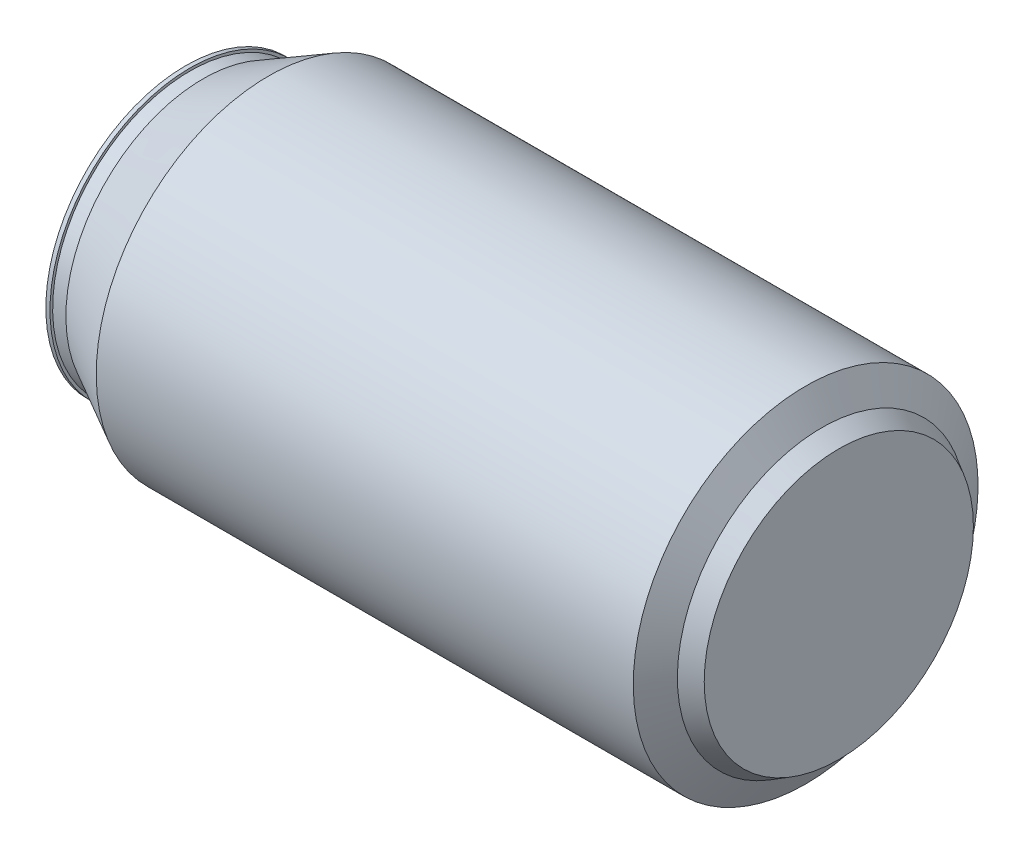
ISO-10303-21;
HEADER;
FILE_DESCRIPTION(('STEP AP214'),'2;1');
FILE_NAME('part.step','',(''),(''),'','','');
FILE_SCHEMA(('AUTOMOTIVE_DESIGN { 1 0 10303 214 1 1 1 1 }'));
ENDSEC;
DATA;
#1=APPLICATION_CONTEXT('core data for automotive mechanical design processes');
#2=APPLICATION_PROTOCOL_DEFINITION('international standard','automotive_design',2000,#1);
#3=PRODUCT_CONTEXT('',#1,'mechanical');
#4=PRODUCT('Part','Part','',(#3));
#5=PRODUCT_RELATED_PRODUCT_CATEGORY('part','',(#4));
#6=PRODUCT_DEFINITION_FORMATION('','',#4);
#7=PRODUCT_DEFINITION_CONTEXT('part definition',#1,'design');
#8=PRODUCT_DEFINITION('design','',#6,#7);
#9=PRODUCT_DEFINITION_SHAPE('','',#8);
#10=(LENGTH_UNIT() NAMED_UNIT(*) SI_UNIT(.MILLI.,.METRE.));
#11=(NAMED_UNIT(*) PLANE_ANGLE_UNIT() SI_UNIT($,.RADIAN.));
#12=(NAMED_UNIT(*) SI_UNIT($,.STERADIAN.) SOLID_ANGLE_UNIT());
#13=UNCERTAINTY_MEASURE_WITH_UNIT(LENGTH_MEASURE(1.E-05),#10,'distance_accuracy_value','');
#14=(GEOMETRIC_REPRESENTATION_CONTEXT(3) GLOBAL_UNCERTAINTY_ASSIGNED_CONTEXT((#13)) GLOBAL_UNIT_ASSIGNED_CONTEXT((#10,
#11,#12)) REPRESENTATION_CONTEXT('',''));
#15=CARTESIAN_POINT('',(0.,0.,0.));
#16=DIRECTION('',(0.,0.,1.));
#17=DIRECTION('',(1.,0.,0.));
#18=AXIS2_PLACEMENT_3D('',#15,#16,#17);
#19=CARTESIAN_POINT('',(0.,0.,0.));
#20=DIRECTION('',(1.,0.,0.));
#21=DIRECTION('',(0.,1.,0.));
#22=AXIS2_PLACEMENT_3D('',#19,#20,#21);
#23=PLANE('',#22);
#24=CARTESIAN_POINT('',(0.,0.,0.));
#25=DIRECTION('',(-1.,0.,0.));
#26=DIRECTION('',(0.,-1.,0.));
#27=AXIS2_PLACEMENT_3D('',#24,#25,#26);
#28=CIRCLE('',#27,26.797);
#29=CARTESIAN_POINT('',(0.,-26.797,0.));
#30=VERTEX_POINT('',#29);
#31=EDGE_CURVE('E10',#30,#30,#28,.T.);
#32=ORIENTED_EDGE('',*,*,#31,.T.);
#33=EDGE_LOOP('',(#32));
#34=FACE_BOUND('',#33,.T.);
#35=ADVANCED_FACE('F347',(#34),#23,.F.);
#36=CARTESIAN_POINT('',(-7.47694499383202,0.,0.));
#37=DIRECTION('',(-1.,0.,0.));
#38=DIRECTION('',(0.,-1.,0.));
#39=AXIS2_PLACEMENT_3D('',#36,#37,#38);
#40=CYLINDRICAL_SURFACE('',#39,26.797);
#41=ORIENTED_EDGE('',*,*,#31,.F.);
#42=EDGE_LOOP('',(#41));
#43=FACE_BOUND('',#42,.T.);
#44=CARTESIAN_POINT('',(0.793749999999999,0.,0.));
#45=DIRECTION('',(-1.,0.,0.));
#46=DIRECTION('',(0.,-1.,0.));
#47=AXIS2_PLACEMENT_3D('',#44,#45,#46);
#48=CIRCLE('',#47,26.797);
#49=CARTESIAN_POINT('',(0.793749999999999,-26.797,0.));
#50=VERTEX_POINT('',#49);
#51=EDGE_CURVE('E354',#50,#50,#48,.T.);
#52=ORIENTED_EDGE('',*,*,#51,.T.);
#53=EDGE_LOOP('',(#52));
#54=FACE_BOUND('',#53,.T.);
#55=ADVANCED_FACE('F449',(#43,#54),#40,.T.);
#56=CARTESIAN_POINT('',(0.79375,26.289,0.));
#57=DIRECTION('',(-1.,0.,0.));
#58=DIRECTION('',(0.,-1.,0.));
#59=AXIS2_PLACEMENT_3D('',#56,#57,#58);
#60=PLANE('',#59);
#61=ORIENTED_EDGE('',*,*,#51,.F.);
#62=EDGE_LOOP('',(#61));
#63=FACE_BOUND('',#62,.T.);
#64=CARTESIAN_POINT('',(0.793749999999999,0.,0.));
#65=DIRECTION('',(-1.,0.,0.));
#66=DIRECTION('',(0.,-1.,0.));
#67=AXIS2_PLACEMENT_3D('',#64,#65,#66);
#68=CIRCLE('',#67,26.289);
#69=CARTESIAN_POINT('',(0.793749999999999,-26.289,0.));
#70=VERTEX_POINT('',#69);
#71=EDGE_CURVE('E358',#70,#70,#68,.T.);
#72=ORIENTED_EDGE('',*,*,#71,.T.);
#73=EDGE_LOOP('',(#72));
#74=FACE_BOUND('',#73,.T.);
#75=ADVANCED_FACE('F446',(#63,#74),#60,.F.);
#76=CARTESIAN_POINT('',(-7.47694499383202,0.,0.));
#77=DIRECTION('',(-1.,0.,0.));
#78=DIRECTION('',(0.,-1.,0.));
#79=AXIS2_PLACEMENT_3D('',#76,#77,#78);
#80=CYLINDRICAL_SURFACE('',#79,26.289);
#81=ORIENTED_EDGE('',*,*,#71,.F.);
#82=EDGE_LOOP('',(#81));
#83=FACE_BOUND('',#82,.T.);
#84=CARTESIAN_POINT('',(3.33375,0.,0.));
#85=DIRECTION('',(-1.,0.,0.));
#86=DIRECTION('',(0.,-1.,0.));
#87=AXIS2_PLACEMENT_3D('',#84,#85,#86);
#88=CIRCLE('',#87,26.289);
#89=CARTESIAN_POINT('',(3.33375,-26.289,0.));
#90=VERTEX_POINT('',#89);
#91=EDGE_CURVE('E362',#90,#90,#88,.T.);
#92=ORIENTED_EDGE('',*,*,#91,.T.);
#93=EDGE_LOOP('',(#92));
#94=FACE_BOUND('',#93,.T.);
#95=ADVANCED_FACE('F442',(#83,#94),#80,.T.);
#96=CARTESIAN_POINT('',(15.875,0.,0.));
#97=DIRECTION('',(1.,0.,0.));
#98=DIRECTION('',(0.,1.,0.));
#99=AXIS2_PLACEMENT_3D('',#96,#97,#98);
#100=CONICAL_SURFACE('',#99,33.02,0.492581647745163);
#101=ORIENTED_EDGE('',*,*,#91,.F.);
#102=EDGE_LOOP('',(#101));
#103=FACE_BOUND('',#102,.T.);
#104=CARTESIAN_POINT('',(15.875,0.,0.));
#105=DIRECTION('',(-1.,0.,0.));
#106=DIRECTION('',(0.,-1.,0.));
#107=AXIS2_PLACEMENT_3D('',#104,#105,#106);
#108=CIRCLE('',#107,33.02);
#109=CARTESIAN_POINT('',(15.875,-33.02,0.));
#110=VERTEX_POINT('',#109);
#111=EDGE_CURVE('E367',#110,#110,#108,.T.);
#112=ORIENTED_EDGE('',*,*,#111,.T.);
#113=EDGE_LOOP('',(#112));
#114=FACE_BOUND('',#113,.T.);
#115=ADVANCED_FACE('F438',(#103,#114),#100,.T.);
#116=CARTESIAN_POINT('',(-7.47694499383202,0.,0.));
#117=DIRECTION('',(-1.,0.,0.));
#118=DIRECTION('',(0.,-1.,0.));
#119=AXIS2_PLACEMENT_3D('',#116,#117,#118);
#120=CYLINDRICAL_SURFACE('',#119,33.02);
#121=ORIENTED_EDGE('',*,*,#111,.F.);
#122=EDGE_LOOP('',(#121));
#123=FACE_BOUND('',#122,.T.);
#124=CARTESIAN_POINT('',(118.745,0.,0.));
#125=DIRECTION('',(-1.,0.,0.));
#126=DIRECTION('',(0.,-1.,0.));
#127=AXIS2_PLACEMENT_3D('',#124,#125,#126);
#128=CIRCLE('',#127,33.0200000000001);
#129=CARTESIAN_POINT('',(118.745,-33.0200000000001,0.));
#130=VERTEX_POINT('',#129);
#131=EDGE_CURVE('E370',#130,#130,#128,.T.);
#132=ORIENTED_EDGE('',*,*,#131,.T.);
#133=EDGE_LOOP('',(#132));
#134=FACE_BOUND('',#133,.T.);
#135=ADVANCED_FACE('F434',(#123,#134),#120,.T.);
#136=CARTESIAN_POINT('',(121.839157897996,0.,0.));
#137=DIRECTION('',(-1.,0.,0.));
#138=DIRECTION('',(0.,-1.,0.));
#139=AXIS2_PLACEMENT_3D('',#136,#137,#138);
#140=CONICAL_SURFACE('',#139,27.6607613140312,1.0471975511966);
#141=ORIENTED_EDGE('',*,*,#131,.F.);
#142=EDGE_LOOP('',(#141));
#143=FACE_BOUND('',#142,.T.);
#144=CARTESIAN_POINT('',(121.839157897996,0.,0.));
#145=DIRECTION('',(-1.,0.,0.));
#146=DIRECTION('',(0.,-1.,0.));
#147=AXIS2_PLACEMENT_3D('',#144,#145,#146);
#148=CIRCLE('',#147,27.6607613140312);
#149=CARTESIAN_POINT('',(121.839157897996,-27.6607613140312,0.));
#150=VERTEX_POINT('',#149);
#151=EDGE_CURVE('E373',#150,#150,#148,.T.);
#152=ORIENTED_EDGE('',*,*,#151,.T.);
#153=EDGE_LOOP('',(#152));
#154=FACE_BOUND('',#153,.T.);
#155=ADVANCED_FACE('F430',(#143,#154),#140,.T.);
#156=CARTESIAN_POINT('',(125.095,0.,0.));
#157=DIRECTION('',(-1.,0.,0.));
#158=DIRECTION('',(0.,-1.,0.));
#159=AXIS2_PLACEMENT_3D('',#156,#157,#158);
#160=CONICAL_SURFACE('',#159,25.781,0.523598775598301);
#161=ORIENTED_EDGE('',*,*,#151,.F.);
#162=EDGE_LOOP('',(#161));
#163=FACE_BOUND('',#162,.T.);
#164=CARTESIAN_POINT('',(125.095,0.,0.));
#165=DIRECTION('',(-1.,0.,0.));
#166=DIRECTION('',(0.,-1.,0.));
#167=AXIS2_PLACEMENT_3D('',#164,#165,#166);
#168=CIRCLE('',#167,25.781);
#169=CARTESIAN_POINT('',(125.095,-25.781,0.));
#170=VERTEX_POINT('',#169);
#171=EDGE_CURVE('E376',#170,#170,#168,.T.);
#172=ORIENTED_EDGE('',*,*,#171,.T.);
#173=EDGE_LOOP('',(#172));
#174=FACE_BOUND('',#173,.T.);
#175=ADVANCED_FACE('F426',(#163,#174),#160,.T.);
#176=CARTESIAN_POINT('',(125.095,25.781,0.));
#177=DIRECTION('',(-1.,0.,0.));
#178=DIRECTION('',(0.,-1.,0.));
#179=AXIS2_PLACEMENT_3D('',#176,#177,#178);
#180=PLANE('',#179);
#181=ORIENTED_EDGE('',*,*,#171,.F.);
#182=EDGE_LOOP('',(#181));
#183=FACE_BOUND('',#182,.T.);
#184=ADVANCED_FACE('F424',(#183),#180,.F.);
#185=CLOSED_SHELL('',(#35,#55,#75,#95,#115,#135,#155,#175,#184));
#186=CARTESIAN_POINT('',(124.30125,25.3227282238308,0.));
#187=DIRECTION('',(1.,0.,0.));
#188=DIRECTION('',(0.,1.,0.));
#189=AXIS2_PLACEMENT_3D('',#186,#187,#188);
#190=PLANE('',#189);
#191=CARTESIAN_POINT('',(124.30125,0.,0.));
#192=DIRECTION('',(-1.,0.,0.));
#193=DIRECTION('',(0.,-1.,0.));
#194=AXIS2_PLACEMENT_3D('',#191,#192,#193);
#195=CIRCLE('',#194,25.3227282238308);
#196=CARTESIAN_POINT('',(124.30125,-25.3227282238308,0.));
#197=VERTEX_POINT('',#196);
#198=EDGE_CURVE('E379',#197,#197,#195,.T.);
#199=ORIENTED_EDGE('',*,*,#198,.T.);
#200=EDGE_LOOP('',(#199));
#201=FACE_BOUND('',#200,.T.);
#202=ADVANCED_FACE('F410',(#201),#190,.F.);
#203=CARTESIAN_POINT('',(121.258092569488,0.,0.));
#204=DIRECTION('',(-1.,0.,0.));
#205=DIRECTION('',(0.,-1.,0.));
#206=AXIS2_PLACEMENT_3D('',#203,#204,#205);
#207=CONICAL_SURFACE('',#206,27.0796959855234,0.5235987755983);
#208=ORIENTED_EDGE('',*,*,#198,.F.);
#209=EDGE_LOOP('',(#208));
#210=FACE_BOUND('',#209,.T.);
#211=CARTESIAN_POINT('',(121.258092569488,0.,0.));
#212=DIRECTION('',(-1.,0.,0.));
#213=DIRECTION('',(0.,-1.,0.));
#214=AXIS2_PLACEMENT_3D('',#211,#212,#213);
#215=CIRCLE('',#214,27.0796959855234);
#216=CARTESIAN_POINT('',(121.258092569488,-27.0796959855234,0.));
#217=VERTEX_POINT('',#216);
#218=EDGE_CURVE('E382',#217,#217,#215,.T.);
#219=ORIENTED_EDGE('',*,*,#218,.T.);
#220=EDGE_LOOP('',(#219));
#221=FACE_BOUND('',#220,.T.);
#222=ADVANCED_FACE('F412',(#210,#221),#207,.F.);
#223=CARTESIAN_POINT('',(118.286728223831,0.,0.));
#224=DIRECTION('',(-1.,0.,0.));
#225=DIRECTION('',(0.,-1.,0.));
#226=AXIS2_PLACEMENT_3D('',#223,#224,#225);
#227=CONICAL_SURFACE('',#226,32.22625,1.0471975511966);
#228=ORIENTED_EDGE('',*,*,#218,.F.);
#229=EDGE_LOOP('',(#228));
#230=FACE_BOUND('',#229,.T.);
#231=CARTESIAN_POINT('',(118.286728223831,0.,0.));
#232=DIRECTION('',(-1.,0.,0.));
#233=DIRECTION('',(0.,-1.,0.));
#234=AXIS2_PLACEMENT_3D('',#231,#232,#233);
#235=CIRCLE('',#234,32.22625);
#236=CARTESIAN_POINT('',(118.286728223831,-32.22625,0.));
#237=VERTEX_POINT('',#236);
#238=EDGE_CURVE('E385',#237,#237,#235,.T.);
#239=ORIENTED_EDGE('',*,*,#238,.T.);
#240=EDGE_LOOP('',(#239));
#241=FACE_BOUND('',#240,.T.);
#242=ADVANCED_FACE('F419',(#230,#241),#227,.F.);
#243=CARTESIAN_POINT('',(-7.47694499383202,0.,0.));
#244=DIRECTION('',(-1.,0.,0.));
#245=DIRECTION('',(0.,-1.,0.));
#246=AXIS2_PLACEMENT_3D('',#243,#244,#245);
#247=CYLINDRICAL_SURFACE('',#246,32.22625);
#248=ORIENTED_EDGE('',*,*,#238,.F.);
#249=EDGE_LOOP('',(#248));
#250=FACE_BOUND('',#249,.T.);
#251=CARTESIAN_POINT('',(16.0745444868379,0.,0.));
#252=DIRECTION('',(-1.,0.,0.));
#253=DIRECTION('',(0.,-1.,0.));
#254=AXIS2_PLACEMENT_3D('',#251,#252,#253);
#255=CIRCLE('',#254,32.22625);
#256=CARTESIAN_POINT('',(16.0745444868379,-32.22625,0.));
#257=VERTEX_POINT('',#256);
#258=EDGE_CURVE('E388',#257,#257,#255,.T.);
#259=ORIENTED_EDGE('',*,*,#258,.T.);
#260=EDGE_LOOP('',(#259));
#261=FACE_BOUND('',#260,.T.);
#262=ADVANCED_FACE('F501',(#250,#261),#247,.F.);
#263=CARTESIAN_POINT('',(3.5332944868379,0.,0.));
#264=DIRECTION('',(1.,0.,0.));
#265=DIRECTION('',(0.,1.,0.));
#266=AXIS2_PLACEMENT_3D('',#263,#264,#265);
#267=CONICAL_SURFACE('',#266,25.49525,0.492581647745163);
#268=ORIENTED_EDGE('',*,*,#258,.F.);
#269=EDGE_LOOP('',(#268));
#270=FACE_BOUND('',#269,.T.);
#271=CARTESIAN_POINT('',(3.5332944868379,0.,0.));
#272=DIRECTION('',(-1.,0.,0.));
#273=DIRECTION('',(0.,-1.,0.));
#274=AXIS2_PLACEMENT_3D('',#271,#272,#273);
#275=CIRCLE('',#274,25.49525);
#276=CARTESIAN_POINT('',(3.5332944868379,-25.49525,0.));
#277=VERTEX_POINT('',#276);
#278=EDGE_CURVE('E391',#277,#277,#275,.T.);
#279=ORIENTED_EDGE('',*,*,#278,.T.);
#280=EDGE_LOOP('',(#279));
#281=FACE_BOUND('',#280,.T.);
#282=ADVANCED_FACE('F407',(#270,#281),#267,.F.);
#283=CARTESIAN_POINT('',(-7.47694499383202,0.,0.));
#284=DIRECTION('',(-1.,0.,0.));
#285=DIRECTION('',(0.,-1.,0.));
#286=AXIS2_PLACEMENT_3D('',#283,#284,#285);
#287=CYLINDRICAL_SURFACE('',#286,25.49525);
#288=ORIENTED_EDGE('',*,*,#278,.F.);
#289=EDGE_LOOP('',(#288));
#290=FACE_BOUND('',#289,.T.);
#291=CARTESIAN_POINT('',(0.793749999999999,0.,0.));
#292=DIRECTION('',(-1.,0.,0.));
#293=DIRECTION('',(0.,-1.,0.));
#294=AXIS2_PLACEMENT_3D('',#291,#292,#293);
#295=CIRCLE('',#294,25.49525);
#296=CARTESIAN_POINT('',(0.793749999999999,-25.49525,0.));
#297=VERTEX_POINT('',#296);
#298=EDGE_CURVE('E394',#297,#297,#295,.T.);
#299=ORIENTED_EDGE('',*,*,#298,.T.);
#300=EDGE_LOOP('',(#299));
#301=FACE_BOUND('',#300,.T.);
#302=ADVANCED_FACE('F398',(#290,#301),#287,.F.);
#303=CARTESIAN_POINT('',(0.79375,0.,0.));
#304=DIRECTION('',(-1.,0.,0.));
#305=DIRECTION('',(0.,-1.,0.));
#306=AXIS2_PLACEMENT_3D('',#303,#304,#305);
#307=PLANE('',#306);
#308=ORIENTED_EDGE('',*,*,#298,.F.);
#309=EDGE_LOOP('',(#308));
#310=FACE_BOUND('',#309,.T.);
#311=ADVANCED_FACE('F400',(#310),#307,.F.);
#312=CLOSED_SHELL('',(#202,#222,#242,#262,#282,#302,#311));
#313=ORIENTED_CLOSED_SHELL('',*,#312,.T.);
#314=BREP_WITH_VOIDS('B2',#185,(#313));
#315=ADVANCED_BREP_SHAPE_REPRESENTATION('',(#18,#314),#14);
#316=SHAPE_DEFINITION_REPRESENTATION(#9,#315);
ENDSEC;
END-ISO-10303-21;
